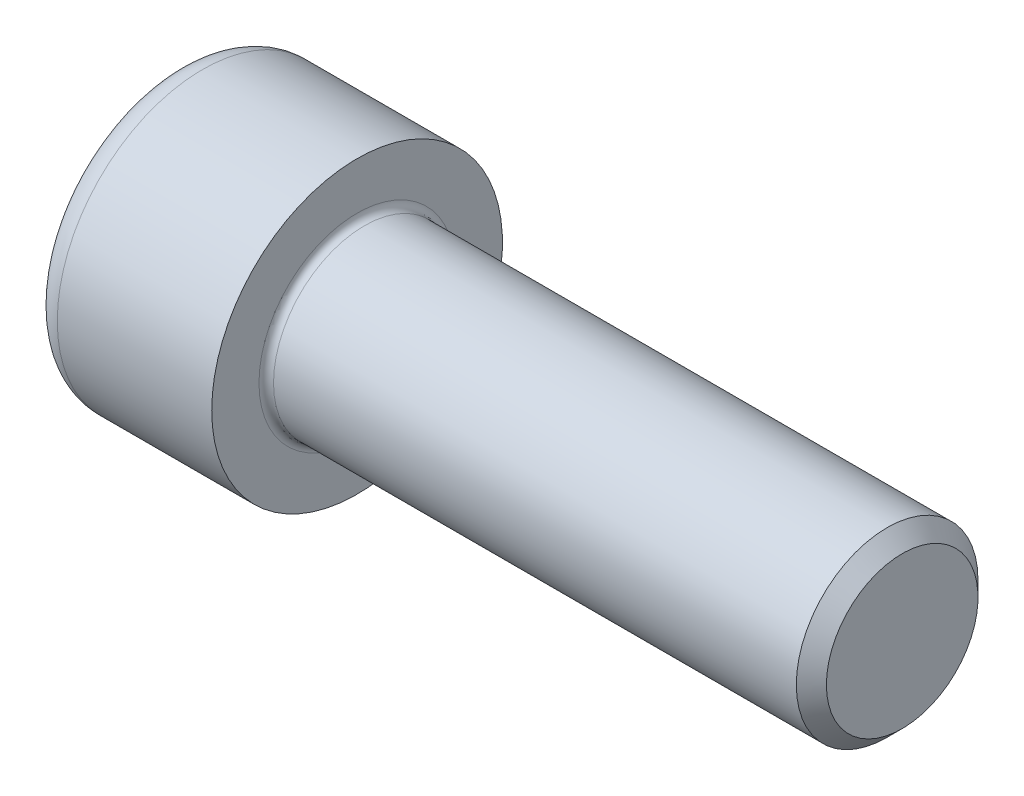
ISO-10303-21;
HEADER;
FILE_DESCRIPTION(('STEP AP214'),'2;1');
FILE_NAME('part.step','',(''),(''),'','','');
FILE_SCHEMA(('AUTOMOTIVE_DESIGN { 1 0 10303 214 1 1 1 1 }'));
ENDSEC;
DATA;
#1=APPLICATION_CONTEXT('core data for automotive mechanical design processes');
#2=APPLICATION_PROTOCOL_DEFINITION('international standard','automotive_design',2000,#1);
#3=PRODUCT_CONTEXT('',#1,'mechanical');
#4=PRODUCT('Part','Part','',(#3));
#5=PRODUCT_RELATED_PRODUCT_CATEGORY('part','',(#4));
#6=PRODUCT_DEFINITION_FORMATION('','',#4);
#7=PRODUCT_DEFINITION_CONTEXT('part definition',#1,'design');
#8=PRODUCT_DEFINITION('design','',#6,#7);
#9=PRODUCT_DEFINITION_SHAPE('','',#8);
#10=(LENGTH_UNIT() NAMED_UNIT(*) SI_UNIT(.MILLI.,.METRE.));
#11=(NAMED_UNIT(*) PLANE_ANGLE_UNIT() SI_UNIT($,.RADIAN.));
#12=(NAMED_UNIT(*) SI_UNIT($,.STERADIAN.) SOLID_ANGLE_UNIT());
#13=UNCERTAINTY_MEASURE_WITH_UNIT(LENGTH_MEASURE(1.E-05),#10,'distance_accuracy_value','');
#14=(GEOMETRIC_REPRESENTATION_CONTEXT(3) GLOBAL_UNCERTAINTY_ASSIGNED_CONTEXT((#13)) GLOBAL_UNIT_ASSIGNED_CONTEXT((#10,
#11,#12)) REPRESENTATION_CONTEXT('',''));
#15=CARTESIAN_POINT('',(0.,0.,0.));
#16=DIRECTION('',(0.,0.,1.));
#17=DIRECTION('',(1.,0.,0.));
#18=AXIS2_PLACEMENT_3D('',#15,#16,#17);
#19=CARTESIAN_POINT('',(0.,0.,0.));
#20=DIRECTION('',(-1.,0.,0.));
#21=DIRECTION('',(0.,0.,1.));
#22=AXIS2_PLACEMENT_3D('',#19,#20,#21);
#23=PLANE('',#22);
#24=DIRECTION('',(0.,-0.499999999999999,0.866025403784439));
#25=VECTOR('',#24,1.);
#26=CARTESIAN_POINT('',(0.,4.68519743447381,0.));
#27=LINE('',#26,#25);
#28=CARTESIAN_POINT('',(0.,4.68519743447381,0.));
#29=VERTEX_POINT('',#28);
#30=CARTESIAN_POINT('',(0.,2.34259871723691,4.05749999999999));
#31=VERTEX_POINT('',#30);
#32=EDGE_CURVE('E122',#29,#31,#27,.T.);
#33=ORIENTED_EDGE('',*,*,#32,.T.);
#34=DIRECTION('',(0.,1.,0.));
#35=VECTOR('',#34,1.);
#36=CARTESIAN_POINT('',(0.,-2.3425987172369,4.0575));
#37=LINE('',#36,#35);
#38=CARTESIAN_POINT('',(0.,-2.3425987172369,4.0575));
#39=VERTEX_POINT('',#38);
#40=EDGE_CURVE('E111',#39,#31,#37,.T.);
#41=ORIENTED_EDGE('',*,*,#40,.F.);
#42=DIRECTION('',(0.,-0.500000000000001,-0.866025403784438));
#43=VECTOR('',#42,1.);
#44=CARTESIAN_POINT('',(0.,-2.3425987172369,4.0575));
#45=LINE('',#44,#43);
#46=CARTESIAN_POINT('',(0.,-4.68519743447382,0.));
#47=VERTEX_POINT('',#46);
#48=EDGE_CURVE('E121',#39,#47,#45,.T.);
#49=ORIENTED_EDGE('',*,*,#48,.T.);
#50=DIRECTION('',(0.,0.499999999999999,-0.866025403784439));
#51=VECTOR('',#50,1.);
#52=CARTESIAN_POINT('',(0.,-4.68519743447382,0.));
#53=LINE('',#52,#51);
#54=CARTESIAN_POINT('',(0.,-2.34259871723692,-4.0575));
#55=VERTEX_POINT('',#54);
#56=EDGE_CURVE('E140',#47,#55,#53,.T.);
#57=ORIENTED_EDGE('',*,*,#56,.T.);
#58=DIRECTION('',(0.,-1.,0.));
#59=VECTOR('',#58,1.);
#60=CARTESIAN_POINT('',(0.,2.3425987172369,-4.05750000000001));
#61=LINE('',#60,#59);
#62=CARTESIAN_POINT('',(0.,2.3425987172369,-4.05750000000001));
#63=VERTEX_POINT('',#62);
#64=EDGE_CURVE('E143',#63,#55,#61,.T.);
#65=ORIENTED_EDGE('',*,*,#64,.F.);
#66=DIRECTION('',(0.,-0.500000000000001,-0.866025403784438));
#67=VECTOR('',#66,1.);
#68=CARTESIAN_POINT('',(0.,4.68519743447381,0.));
#69=LINE('',#68,#67);
#70=EDGE_CURVE('E136',#29,#63,#69,.T.);
#71=ORIENTED_EDGE('',*,*,#70,.F.);
#72=EDGE_LOOP('',(#33,#41,#49,#57,#65,#71));
#73=FACE_BOUND('',#72,.T.);
#74=CARTESIAN_POINT('',(0.,0.,0.));
#75=DIRECTION('',(-1.,0.,0.));
#76=DIRECTION('',(0.,0.,1.));
#77=AXIS2_PLACEMENT_3D('',#74,#75,#76);
#78=CIRCLE('',#77,6.5);
#79=CARTESIAN_POINT('',(0.,0.,6.5));
#80=VERTEX_POINT('',#79);
#81=EDGE_CURVE('E47',#80,#80,#78,.T.);
#82=ORIENTED_EDGE('',*,*,#81,.T.);
#83=EDGE_LOOP('',(#82));
#84=FACE_BOUND('',#83,.T.);
#85=ADVANCED_FACE('F40',(#73,#84),#23,.T.);
#86=CARTESIAN_POINT('',(-31.75,0.,0.));
#87=DIRECTION('',(-1.,0.,0.));
#88=DIRECTION('',(0.,0.,1.));
#89=AXIS2_PLACEMENT_3D('',#86,#87,#88);
#90=CYLINDRICAL_SURFACE('',#89,8.);
#91=CARTESIAN_POINT('',(1.5,0.,0.));
#92=DIRECTION('',(-1.,0.,0.));
#93=DIRECTION('',(0.,0.,1.));
#94=AXIS2_PLACEMENT_3D('',#91,#92,#93);
#95=CIRCLE('',#94,8.);
#96=CARTESIAN_POINT('',(1.5,0.,8.));
#97=VERTEX_POINT('',#96);
#98=EDGE_CURVE('E11',#97,#97,#95,.F.);
#99=ORIENTED_EDGE('',*,*,#98,.T.);
#100=EDGE_LOOP('',(#99));
#101=FACE_BOUND('',#100,.T.);
#102=CARTESIAN_POINT('',(10.,0.,0.));
#103=DIRECTION('',(-1.,0.,0.));
#104=DIRECTION('',(0.,0.,1.));
#105=AXIS2_PLACEMENT_3D('',#102,#103,#104);
#106=CIRCLE('',#105,8.);
#107=CARTESIAN_POINT('',(10.,0.,8.));
#108=VERTEX_POINT('',#107);
#109=EDGE_CURVE('E188',#108,#108,#106,.T.);
#110=ORIENTED_EDGE('',*,*,#109,.T.);
#111=EDGE_LOOP('',(#110));
#112=FACE_BOUND('',#111,.T.);
#113=ADVANCED_FACE('F215',(#101,#112),#90,.T.);
#114=CARTESIAN_POINT('',(10.,8.,0.));
#115=DIRECTION('',(1.,0.,0.));
#116=DIRECTION('',(0.,0.,-1.));
#117=AXIS2_PLACEMENT_3D('',#114,#115,#116);
#118=PLANE('',#117);
#119=CARTESIAN_POINT('',(10.,0.,0.));
#120=DIRECTION('',(1.,0.,0.));
#121=DIRECTION('',(0.,0.,-1.));
#122=AXIS2_PLACEMENT_3D('',#119,#120,#121);
#123=CIRCLE('',#122,5.39999999999999);
#124=CARTESIAN_POINT('',(10.,0.,-5.39999999999999));
#125=VERTEX_POINT('',#124);
#126=EDGE_CURVE('E191',#125,#125,#123,.F.);
#127=ORIENTED_EDGE('',*,*,#126,.T.);
#128=EDGE_LOOP('',(#127));
#129=FACE_BOUND('',#128,.T.);
#130=ORIENTED_EDGE('',*,*,#109,.F.);
#131=EDGE_LOOP('',(#130));
#132=FACE_BOUND('',#131,.T.);
#133=ADVANCED_FACE('F219',(#129,#132),#118,.T.);
#134=CARTESIAN_POINT('',(-31.75,0.,0.));
#135=DIRECTION('',(-1.,0.,0.));
#136=DIRECTION('',(0.,0.,1.));
#137=AXIS2_PLACEMENT_3D('',#134,#135,#136);
#138=CYLINDRICAL_SURFACE('',#137,4.99999999999999);
#139=CARTESIAN_POINT('',(10.4,0.,0.));
#140=DIRECTION('',(1.,0.,0.));
#141=DIRECTION('',(0.,0.,-1.));
#142=AXIS2_PLACEMENT_3D('',#139,#140,#141);
#143=CIRCLE('',#142,4.99999999999999);
#144=CARTESIAN_POINT('',(10.4,0.,-4.99999999999999));
#145=VERTEX_POINT('',#144);
#146=EDGE_CURVE('E194',#145,#145,#143,.T.);
#147=ORIENTED_EDGE('',*,*,#146,.T.);
#148=EDGE_LOOP('',(#147));
#149=FACE_BOUND('',#148,.T.);
#150=CARTESIAN_POINT('',(39.172,0.,0.));
#151=DIRECTION('',(-1.,0.,0.));
#152=DIRECTION('',(0.,0.,1.));
#153=AXIS2_PLACEMENT_3D('',#150,#151,#152);
#154=CIRCLE('',#153,4.99999999999998);
#155=CARTESIAN_POINT('',(39.172,0.,4.99999999999998));
#156=VERTEX_POINT('',#155);
#157=EDGE_CURVE('E185',#156,#156,#154,.T.);
#158=ORIENTED_EDGE('',*,*,#157,.T.);
#159=EDGE_LOOP('',(#158));
#160=FACE_BOUND('',#159,.T.);
#161=ADVANCED_FACE('F224',(#149,#160),#138,.T.);
#162=CARTESIAN_POINT('',(40.,0.,0.));
#163=DIRECTION('',(-1.,0.,0.));
#164=DIRECTION('',(0.,0.,1.));
#165=AXIS2_PLACEMENT_3D('',#162,#163,#164);
#166=CONICAL_SURFACE('',#165,4.172,0.785398163397433);
#167=ORIENTED_EDGE('',*,*,#157,.F.);
#168=EDGE_LOOP('',(#167));
#169=FACE_BOUND('',#168,.T.);
#170=CARTESIAN_POINT('',(40.,0.,0.));
#171=DIRECTION('',(-1.,0.,0.));
#172=DIRECTION('',(0.,0.,1.));
#173=AXIS2_PLACEMENT_3D('',#170,#171,#172);
#174=CIRCLE('',#173,4.172);
#175=CARTESIAN_POINT('',(40.,0.,4.172));
#176=VERTEX_POINT('',#175);
#177=EDGE_CURVE('E181',#176,#176,#174,.T.);
#178=ORIENTED_EDGE('',*,*,#177,.T.);
#179=EDGE_LOOP('',(#178));
#180=FACE_BOUND('',#179,.T.);
#181=ADVANCED_FACE('F231',(#169,#180),#166,.T.);
#182=CARTESIAN_POINT('',(40.,4.172,0.));
#183=DIRECTION('',(1.,0.,0.));
#184=DIRECTION('',(0.,0.,-1.));
#185=AXIS2_PLACEMENT_3D('',#182,#183,#184);
#186=PLANE('',#185);
#187=ORIENTED_EDGE('',*,*,#177,.F.);
#188=EDGE_LOOP('',(#187));
#189=FACE_BOUND('',#188,.T.);
#190=ADVANCED_FACE('F209',(#189),#186,.T.);
#191=CARTESIAN_POINT('',(10.4,0.,0.));
#192=DIRECTION('',(1.,0.,0.));
#193=DIRECTION('',(0.,0.,-1.));
#194=AXIS2_PLACEMENT_3D('',#191,#192,#193);
#195=TOROIDAL_SURFACE('',#194,5.39999999999999,0.4);
#196=ORIENTED_EDGE('',*,*,#146,.F.);
#197=EDGE_LOOP('',(#196));
#198=FACE_BOUND('',#197,.T.);
#199=ORIENTED_EDGE('',*,*,#126,.F.);
#200=EDGE_LOOP('',(#199));
#201=FACE_BOUND('',#200,.T.);
#202=ADVANCED_FACE('F201',(#198,#201),#195,.F.);
#203=CARTESIAN_POINT('',(1.5,0.,0.));
#204=DIRECTION('',(-1.,0.,0.));
#205=DIRECTION('',(0.,0.,1.));
#206=AXIS2_PLACEMENT_3D('',#203,#204,#205);
#207=TOROIDAL_SURFACE('',#206,6.5,1.5);
#208=ORIENTED_EDGE('',*,*,#98,.F.);
#209=EDGE_LOOP('',(#208));
#210=FACE_BOUND('',#209,.T.);
#211=ORIENTED_EDGE('',*,*,#81,.F.);
#212=EDGE_LOOP('',(#211));
#213=FACE_BOUND('',#212,.T.);
#214=ADVANCED_FACE('F199',(#210,#213),#207,.T.);
#215=CARTESIAN_POINT('',(5.,4.68519743447381,0.));
#216=DIRECTION('',(0.,-0.866025403784439,-0.499999999999999));
#217=DIRECTION('',(0.,0.499999999999999,-0.866025403784439));
#218=AXIS2_PLACEMENT_3D('',#215,#216,#217);
#219=PLANE('',#218);
#220=ORIENTED_EDGE('',*,*,#32,.F.);
#221=DIRECTION('',(-1.,0.,0.));
#222=VECTOR('',#221,1.);
#223=CARTESIAN_POINT('',(5.,4.68519743447381,0.));
#224=LINE('',#223,#222);
#225=CARTESIAN_POINT('',(5.,4.68519743447381,0.));
#226=VERTEX_POINT('',#225);
#227=EDGE_CURVE('E166',#226,#29,#224,.T.);
#228=ORIENTED_EDGE('',*,*,#227,.F.);
#229=DIRECTION('',(0.,-0.499999999999999,0.866025403784439));
#230=VECTOR('',#229,1.);
#231=CARTESIAN_POINT('',(5.,4.68519743447381,0.));
#232=LINE('',#231,#230);
#233=CARTESIAN_POINT('',(5.,3.51389807585536,2.02874999999999));
#234=VERTEX_POINT('',#233);
#235=EDGE_CURVE('E146',#226,#234,#232,.T.);
#236=ORIENTED_EDGE('',*,*,#235,.T.);
#237=CARTESIAN_POINT('',(5.,2.34259871723691,4.05749999999999));
#238=VERTEX_POINT('',#237);
#239=EDGE_CURVE('E130',#234,#238,#232,.T.);
#240=ORIENTED_EDGE('',*,*,#239,.T.);
#241=DIRECTION('',(-1.,0.,0.));
#242=VECTOR('',#241,1.);
#243=CARTESIAN_POINT('',(5.,2.34259871723691,4.05749999999999));
#244=LINE('',#243,#242);
#245=EDGE_CURVE('E115',#238,#31,#244,.T.);
#246=ORIENTED_EDGE('',*,*,#245,.T.);
#247=EDGE_LOOP('',(#220,#228,#236,#240,#246));
#248=FACE_BOUND('',#247,.T.);
#249=ADVANCED_FACE('F126',(#248),#219,.T.);
#250=CARTESIAN_POINT('',(5.,-2.3425987172369,4.0575));
#251=DIRECTION('',(0.,0.,1.));
#252=DIRECTION('',(0.,-1.,0.));
#253=AXIS2_PLACEMENT_3D('',#250,#251,#252);
#254=PLANE('',#253);
#255=ORIENTED_EDGE('',*,*,#40,.T.);
#256=ORIENTED_EDGE('',*,*,#245,.F.);
#257=DIRECTION('',(0.,1.,0.));
#258=VECTOR('',#257,1.);
#259=CARTESIAN_POINT('',(5.,-2.3425987172369,4.0575));
#260=LINE('',#259,#258);
#261=CARTESIAN_POINT('',(5.,0.,4.0575));
#262=VERTEX_POINT('',#261);
#263=EDGE_CURVE('E148',#262,#238,#260,.T.);
#264=ORIENTED_EDGE('',*,*,#263,.F.);
#265=CARTESIAN_POINT('',(5.,-2.3425987172369,4.0575));
#266=VERTEX_POINT('',#265);
#267=EDGE_CURVE('E149',#266,#262,#260,.T.);
#268=ORIENTED_EDGE('',*,*,#267,.F.);
#269=DIRECTION('',(-1.,0.,0.));
#270=VECTOR('',#269,1.);
#271=CARTESIAN_POINT('',(5.,-2.3425987172369,4.0575));
#272=LINE('',#271,#270);
#273=EDGE_CURVE('E117',#266,#39,#272,.T.);
#274=ORIENTED_EDGE('',*,*,#273,.T.);
#275=EDGE_LOOP('',(#255,#256,#264,#268,#274));
#276=FACE_BOUND('',#275,.T.);
#277=ADVANCED_FACE('F113',(#276),#254,.F.);
#278=CARTESIAN_POINT('',(5.,-2.3425987172369,4.0575));
#279=DIRECTION('',(0.,0.866025403784438,-0.500000000000001));
#280=DIRECTION('',(0.,0.500000000000001,0.866025403784438));
#281=AXIS2_PLACEMENT_3D('',#278,#279,#280);
#282=PLANE('',#281);
#283=ORIENTED_EDGE('',*,*,#48,.F.);
#284=ORIENTED_EDGE('',*,*,#273,.F.);
#285=DIRECTION('',(0.,-0.500000000000001,-0.866025403784438));
#286=VECTOR('',#285,1.);
#287=CARTESIAN_POINT('',(5.,-2.3425987172369,4.0575));
#288=LINE('',#287,#286);
#289=CARTESIAN_POINT('',(5.,-3.51389807585536,2.02875));
#290=VERTEX_POINT('',#289);
#291=EDGE_CURVE('E153',#266,#290,#288,.T.);
#292=ORIENTED_EDGE('',*,*,#291,.T.);
#293=CARTESIAN_POINT('',(5.,-4.68519743447382,0.));
#294=VERTEX_POINT('',#293);
#295=EDGE_CURVE('E152',#290,#294,#288,.T.);
#296=ORIENTED_EDGE('',*,*,#295,.T.);
#297=DIRECTION('',(-1.,0.,0.));
#298=VECTOR('',#297,1.);
#299=CARTESIAN_POINT('',(5.,-4.68519743447382,0.));
#300=LINE('',#299,#298);
#301=EDGE_CURVE('E174',#294,#47,#300,.T.);
#302=ORIENTED_EDGE('',*,*,#301,.T.);
#303=EDGE_LOOP('',(#283,#284,#292,#296,#302));
#304=FACE_BOUND('',#303,.T.);
#305=ADVANCED_FACE('F282',(#304),#282,.T.);
#306=CARTESIAN_POINT('',(5.,-4.68519743447382,0.));
#307=DIRECTION('',(0.,0.866025403784439,0.499999999999999));
#308=DIRECTION('',(0.,-0.499999999999999,0.866025403784439));
#309=AXIS2_PLACEMENT_3D('',#306,#307,#308);
#310=PLANE('',#309);
#311=ORIENTED_EDGE('',*,*,#56,.F.);
#312=ORIENTED_EDGE('',*,*,#301,.F.);
#313=DIRECTION('',(0.,0.499999999999999,-0.866025403784439));
#314=VECTOR('',#313,1.);
#315=CARTESIAN_POINT('',(5.,-4.68519743447382,0.));
#316=LINE('',#315,#314);
#317=CARTESIAN_POINT('',(5.,-3.51389807585537,-2.02875));
#318=VERTEX_POINT('',#317);
#319=EDGE_CURVE('E157',#294,#318,#316,.T.);
#320=ORIENTED_EDGE('',*,*,#319,.T.);
#321=CARTESIAN_POINT('',(5.,-2.34259871723692,-4.0575));
#322=VERTEX_POINT('',#321);
#323=EDGE_CURVE('E156',#318,#322,#316,.T.);
#324=ORIENTED_EDGE('',*,*,#323,.T.);
#325=DIRECTION('',(-1.,0.,0.));
#326=VECTOR('',#325,1.);
#327=CARTESIAN_POINT('',(5.,-2.34259871723692,-4.0575));
#328=LINE('',#327,#326);
#329=EDGE_CURVE('E171',#322,#55,#328,.T.);
#330=ORIENTED_EDGE('',*,*,#329,.T.);
#331=EDGE_LOOP('',(#311,#312,#320,#324,#330));
#332=FACE_BOUND('',#331,.T.);
#333=ADVANCED_FACE('F291',(#332),#310,.T.);
#334=CARTESIAN_POINT('',(5.,2.3425987172369,-4.05750000000001));
#335=DIRECTION('',(0.,0.,-1.));
#336=DIRECTION('',(0.,1.,0.));
#337=AXIS2_PLACEMENT_3D('',#334,#335,#336);
#338=PLANE('',#337);
#339=ORIENTED_EDGE('',*,*,#64,.T.);
#340=ORIENTED_EDGE('',*,*,#329,.F.);
#341=DIRECTION('',(0.,-1.,0.));
#342=VECTOR('',#341,1.);
#343=CARTESIAN_POINT('',(5.,2.3425987172369,-4.05750000000001));
#344=LINE('',#343,#342);
#345=CARTESIAN_POINT('',(5.,0.,-4.0575));
#346=VERTEX_POINT('',#345);
#347=EDGE_CURVE('E160',#346,#322,#344,.T.);
#348=ORIENTED_EDGE('',*,*,#347,.F.);
#349=CARTESIAN_POINT('',(5.,2.3425987172369,-4.05750000000001));
#350=VERTEX_POINT('',#349);
#351=EDGE_CURVE('E54',#350,#346,#344,.T.);
#352=ORIENTED_EDGE('',*,*,#351,.F.);
#353=DIRECTION('',(-1.,0.,0.));
#354=VECTOR('',#353,1.);
#355=CARTESIAN_POINT('',(5.,2.3425987172369,-4.05750000000001));
#356=LINE('',#355,#354);
#357=EDGE_CURVE('E168',#350,#63,#356,.T.);
#358=ORIENTED_EDGE('',*,*,#357,.T.);
#359=EDGE_LOOP('',(#339,#340,#348,#352,#358));
#360=FACE_BOUND('',#359,.T.);
#361=ADVANCED_FACE('F301',(#360),#338,.F.);
#362=CARTESIAN_POINT('',(5.,4.68519743447381,0.));
#363=DIRECTION('',(0.,0.866025403784438,-0.500000000000001));
#364=DIRECTION('',(0.,0.500000000000001,0.866025403784438));
#365=AXIS2_PLACEMENT_3D('',#362,#363,#364);
#366=PLANE('',#365);
#367=ORIENTED_EDGE('',*,*,#70,.T.);
#368=ORIENTED_EDGE('',*,*,#357,.F.);
#369=DIRECTION('',(0.,-0.500000000000001,-0.866025403784438));
#370=VECTOR('',#369,1.);
#371=CARTESIAN_POINT('',(5.,4.68519743447381,0.));
#372=LINE('',#371,#370);
#373=CARTESIAN_POINT('',(5.,3.51389807585536,-2.02875));
#374=VERTEX_POINT('',#373);
#375=EDGE_CURVE('E162',#374,#350,#372,.T.);
#376=ORIENTED_EDGE('',*,*,#375,.F.);
#377=EDGE_CURVE('E163',#226,#374,#372,.T.);
#378=ORIENTED_EDGE('',*,*,#377,.F.);
#379=ORIENTED_EDGE('',*,*,#227,.T.);
#380=EDGE_LOOP('',(#367,#368,#376,#378,#379));
#381=FACE_BOUND('',#380,.T.);
#382=ADVANCED_FACE('F311',(#381),#366,.F.);
#383=CARTESIAN_POINT('',(5.,4.68519743447381,0.));
#384=DIRECTION('',(1.,0.,0.));
#385=DIRECTION('',(0.,0.,-1.));
#386=AXIS2_PLACEMENT_3D('',#383,#384,#385);
#387=PLANE('',#386);
#388=ORIENTED_EDGE('',*,*,#347,.T.);
#389=ORIENTED_EDGE('',*,*,#323,.F.);
#390=CARTESIAN_POINT('',(5.,0.,0.));
#391=DIRECTION('',(-1.,0.,0.));
#392=DIRECTION('',(0.,0.,1.));
#393=AXIS2_PLACEMENT_3D('',#390,#391,#392);
#394=CIRCLE('',#393,4.0575);
#395=EDGE_CURVE('E397',#346,#318,#394,.T.);
#396=ORIENTED_EDGE('',*,*,#395,.F.);
#397=EDGE_LOOP('',(#388,#389,#396));
#398=FACE_BOUND('',#397,.T.);
#399=ADVANCED_FACE('F321',(#398),#387,.F.);
#400=ORIENTED_EDGE('',*,*,#319,.F.);
#401=ORIENTED_EDGE('',*,*,#295,.F.);
#402=EDGE_CURVE('E395',#318,#290,#394,.T.);
#403=ORIENTED_EDGE('',*,*,#402,.F.);
#404=EDGE_LOOP('',(#400,#401,#403));
#405=FACE_BOUND('',#404,.T.);
#406=ADVANCED_FACE('F331',(#405),#387,.F.);
#407=ORIENTED_EDGE('',*,*,#291,.F.);
#408=ORIENTED_EDGE('',*,*,#267,.T.);
#409=EDGE_CURVE('E131',#290,#262,#394,.T.);
#410=ORIENTED_EDGE('',*,*,#409,.F.);
#411=EDGE_LOOP('',(#407,#408,#410));
#412=FACE_BOUND('',#411,.T.);
#413=ADVANCED_FACE('F342',(#412),#387,.F.);
#414=ORIENTED_EDGE('',*,*,#263,.T.);
#415=ORIENTED_EDGE('',*,*,#239,.F.);
#416=EDGE_CURVE('E178',#262,#234,#394,.T.);
#417=ORIENTED_EDGE('',*,*,#416,.F.);
#418=EDGE_LOOP('',(#414,#415,#417));
#419=FACE_BOUND('',#418,.T.);
#420=ADVANCED_FACE('F351',(#419),#387,.F.);
#421=ORIENTED_EDGE('',*,*,#235,.F.);
#422=ORIENTED_EDGE('',*,*,#377,.T.);
#423=EDGE_CURVE('E182',#234,#374,#394,.T.);
#424=ORIENTED_EDGE('',*,*,#423,.F.);
#425=EDGE_LOOP('',(#421,#422,#424));
#426=FACE_BOUND('',#425,.T.);
#427=ADVANCED_FACE('F360',(#426),#387,.F.);
#428=ORIENTED_EDGE('',*,*,#375,.T.);
#429=ORIENTED_EDGE('',*,*,#351,.T.);
#430=EDGE_CURVE('E400',#374,#346,#394,.T.);
#431=ORIENTED_EDGE('',*,*,#430,.F.);
#432=EDGE_LOOP('',(#428,#429,#431));
#433=FACE_BOUND('',#432,.T.);
#434=ADVANCED_FACE('F334',(#433),#387,.F.);
#435=CARTESIAN_POINT('',(5.,0.,0.));
#436=DIRECTION('',(-1.,0.,0.));
#437=DIRECTION('',(0.,0.,1.));
#438=AXIS2_PLACEMENT_3D('',#435,#436,#437);
#439=CONICAL_SURFACE('',#438,4.0575,1.04719755119659);
#440=CARTESIAN_POINT('',(7.34259871723693,0.,0.));
#441=VERTEX_POINT('',#440);
#442=VERTEX_LOOP('',#441);
#443=FACE_BOUND('',#442,.T.);
#444=ORIENTED_EDGE('',*,*,#416,.T.);
#445=ORIENTED_EDGE('',*,*,#423,.T.);
#446=ORIENTED_EDGE('',*,*,#430,.T.);
#447=ORIENTED_EDGE('',*,*,#395,.T.);
#448=ORIENTED_EDGE('',*,*,#402,.T.);
#449=ORIENTED_EDGE('',*,*,#409,.T.);
#450=EDGE_LOOP('',(#444,#445,#446,#447,#448,#449));
#451=FACE_BOUND('',#450,.T.);
#452=ADVANCED_FACE('F377',(#443,#451),#439,.F.);
#453=CLOSED_SHELL('',(#85,#113,#133,#161,#181,#190,#202,#214,#249,#277,#305,#333,#361,#382,#399,
#406,#413,#420,#427,#434,#452));
#454=MANIFOLD_SOLID_BREP('B2',#453);
#455=ADVANCED_BREP_SHAPE_REPRESENTATION('',(#18,#454),#14);
#456=SHAPE_DEFINITION_REPRESENTATION(#9,#455);
ENDSEC;
END-ISO-10303-21;
